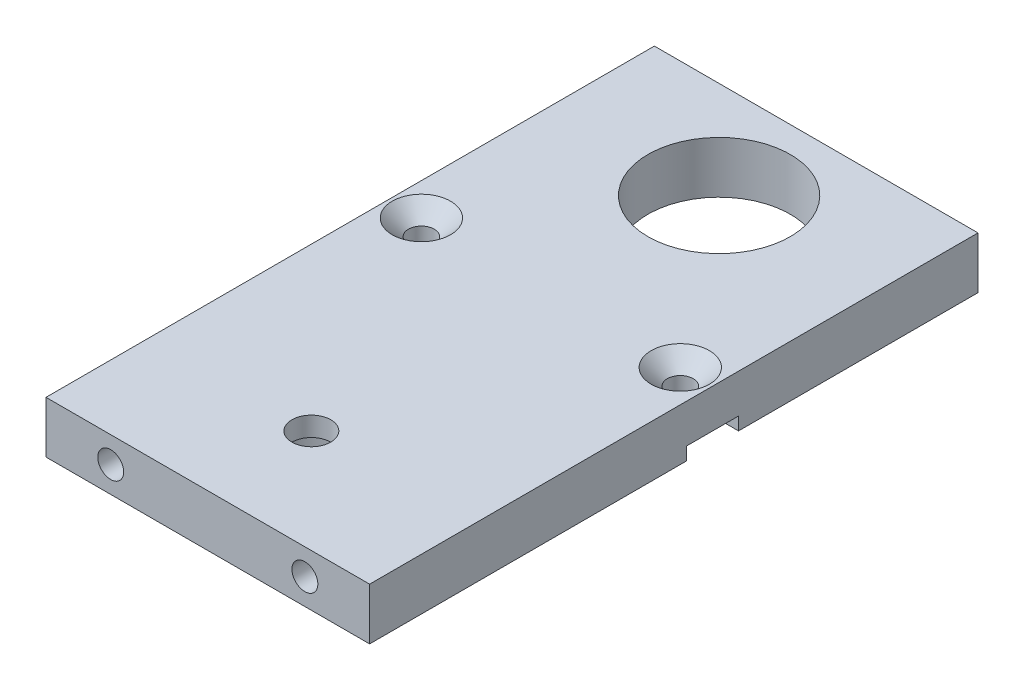
ISO-10303-21;
HEADER;
FILE_DESCRIPTION(('STEP AP214'),'2;1');
FILE_NAME('part.step','',(''),(''),'','','');
FILE_SCHEMA(('AUTOMOTIVE_DESIGN { 1 0 10303 214 1 1 1 1 }'));
ENDSEC;
DATA;
#1=APPLICATION_CONTEXT('core data for automotive mechanical design processes');
#2=APPLICATION_PROTOCOL_DEFINITION('international standard','automotive_design',2000,#1);
#3=PRODUCT_CONTEXT('',#1,'mechanical');
#4=PRODUCT('Part','Part','',(#3));
#5=PRODUCT_RELATED_PRODUCT_CATEGORY('part','',(#4));
#6=PRODUCT_DEFINITION_FORMATION('','',#4);
#7=PRODUCT_DEFINITION_CONTEXT('part definition',#1,'design');
#8=PRODUCT_DEFINITION('design','',#6,#7);
#9=PRODUCT_DEFINITION_SHAPE('','',#8);
#10=(LENGTH_UNIT() NAMED_UNIT(*) SI_UNIT(.MILLI.,.METRE.));
#11=(NAMED_UNIT(*) PLANE_ANGLE_UNIT() SI_UNIT($,.RADIAN.));
#12=(NAMED_UNIT(*) SI_UNIT($,.STERADIAN.) SOLID_ANGLE_UNIT());
#13=UNCERTAINTY_MEASURE_WITH_UNIT(LENGTH_MEASURE(1.E-05),#10,'distance_accuracy_value','');
#14=(GEOMETRIC_REPRESENTATION_CONTEXT(3) GLOBAL_UNCERTAINTY_ASSIGNED_CONTEXT((#13)) GLOBAL_UNIT_ASSIGNED_CONTEXT((#10,
#11,#12)) REPRESENTATION_CONTEXT('',''));
#15=CARTESIAN_POINT('',(0.,0.,0.));
#16=DIRECTION('',(0.,0.,1.));
#17=DIRECTION('',(1.,0.,0.));
#18=AXIS2_PLACEMENT_3D('',#15,#16,#17);
#19=CARTESIAN_POINT('',(0.,0.,0.));
#20=DIRECTION('',(0.,1.,0.));
#21=DIRECTION('',(0.,0.,1.));
#22=AXIS2_PLACEMENT_3D('',#19,#20,#21);
#23=PLANE('',#22);
#24=CARTESIAN_POINT('',(-6.49140893470791,0.,-6.88208118099477));
#25=DIRECTION('',(0.,1.,0.));
#26=DIRECTION('',(0.,0.,1.));
#27=AXIS2_PLACEMENT_3D('',#24,#25,#26);
#28=CIRCLE('',#27,11.);
#29=CARTESIAN_POINT('',(-6.49140893470791,0.,4.11791881900523));
#30=VERTEX_POINT('',#29);
#31=EDGE_CURVE('E163',#30,#30,#28,.T.);
#32=ORIENTED_EDGE('',*,*,#31,.T.);
#33=EDGE_LOOP('',(#32));
#34=FACE_BOUND('',#33,.T.);
#35=DIRECTION('',(0.,0.,-1.));
#36=VECTOR('',#35,1.);
#37=CARTESIAN_POINT('',(18.5085910652921,0.,-21.8820811809948));
#38=LINE('',#37,#36);
#39=CARTESIAN_POINT('',(18.5085910652921,0.,15.1179188190052));
#40=VERTEX_POINT('',#39);
#41=CARTESIAN_POINT('',(18.5085910652921,0.,-21.8820811809948));
#42=VERTEX_POINT('',#41);
#43=EDGE_CURVE('E184',#40,#42,#38,.T.);
#44=ORIENTED_EDGE('',*,*,#43,.F.);
#45=DIRECTION('',(1.,0.,0.));
#46=VECTOR('',#45,1.);
#47=CARTESIAN_POINT('',(18.5085910652921,0.,15.1179188190052));
#48=LINE('',#47,#46);
#49=CARTESIAN_POINT('',(-31.4914089347079,0.,15.1179188190052));
#50=VERTEX_POINT('',#49);
#51=EDGE_CURVE('E125',#50,#40,#48,.T.);
#52=ORIENTED_EDGE('',*,*,#51,.F.);
#53=DIRECTION('',(0.,0.,1.));
#54=VECTOR('',#53,1.);
#55=CARTESIAN_POINT('',(-31.4914089347079,0.,-21.8820811809948));
#56=LINE('',#55,#54);
#57=CARTESIAN_POINT('',(-31.4914089347079,0.,-21.8820811809948));
#58=VERTEX_POINT('',#57);
#59=EDGE_CURVE('E179',#58,#50,#56,.T.);
#60=ORIENTED_EDGE('',*,*,#59,.F.);
#61=DIRECTION('',(-1.,0.,0.));
#62=VECTOR('',#61,1.);
#63=CARTESIAN_POINT('',(-31.4914089347079,0.,-21.8820811809948));
#64=LINE('',#63,#62);
#65=EDGE_CURVE('E80',#42,#58,#64,.T.);
#66=ORIENTED_EDGE('',*,*,#65,.F.);
#67=EDGE_LOOP('',(#44,#52,#60,#66));
#68=FACE_BOUND('',#67,.T.);
#69=ADVANCED_FACE('F34',(#34,#68),#23,.F.);
#70=CARTESIAN_POINT('',(-26.4914089347079,8.,19.1179188190052));
#71=DIRECTION('',(0.,-1.,0.));
#72=DIRECTION('',(0.,0.,-1.));
#73=AXIS2_PLACEMENT_3D('',#70,#71,#72);
#74=CYLINDRICAL_SURFACE('',#73,2.);
#75=CARTESIAN_POINT('',(-26.4914089347079,5.49999999999998,19.1179188190052));
#76=DIRECTION('',(0.,1.,0.));
#77=DIRECTION('',(0.,0.,1.));
#78=AXIS2_PLACEMENT_3D('',#75,#76,#77);
#79=CIRCLE('',#78,2.);
#80=CARTESIAN_POINT('',(-26.4914089347079,5.49999999999998,21.1179188190052));
#81=VERTEX_POINT('',#80);
#82=EDGE_CURVE('E11',#81,#81,#79,.T.);
#83=ORIENTED_EDGE('',*,*,#82,.T.);
#84=EDGE_LOOP('',(#83));
#85=FACE_BOUND('',#84,.T.);
#86=CARTESIAN_POINT('',(-26.4914089347079,2.,19.1179188190052));
#87=DIRECTION('',(0.,-1.,0.));
#88=DIRECTION('',(0.,0.,-1.));
#89=AXIS2_PLACEMENT_3D('',#86,#87,#88);
#90=CIRCLE('',#89,2.);
#91=CARTESIAN_POINT('',(-26.4914089347079,2.,17.1179188190052));
#92=VERTEX_POINT('',#91);
#93=EDGE_CURVE('E138',#92,#92,#90,.T.);
#94=ORIENTED_EDGE('',*,*,#93,.T.);
#95=EDGE_LOOP('',(#94));
#96=FACE_BOUND('',#95,.T.);
#97=ADVANCED_FACE('F215',(#85,#96),#74,.F.);
#98=CARTESIAN_POINT('',(13.5085910652921,8.,19.1179188190052));
#99=DIRECTION('',(0.,-1.,0.));
#100=DIRECTION('',(0.,0.,-1.));
#101=AXIS2_PLACEMENT_3D('',#98,#99,#100);
#102=CYLINDRICAL_SURFACE('',#101,2.);
#103=CARTESIAN_POINT('',(13.5085910652921,5.49999999999998,19.1179188190052));
#104=DIRECTION('',(0.,1.,0.));
#105=DIRECTION('',(0.,0.,1.));
#106=AXIS2_PLACEMENT_3D('',#103,#104,#105);
#107=CIRCLE('',#106,2.);
#108=CARTESIAN_POINT('',(13.5085910652921,5.49999999999998,21.1179188190052));
#109=VERTEX_POINT('',#108);
#110=EDGE_CURVE('E194',#109,#109,#107,.T.);
#111=ORIENTED_EDGE('',*,*,#110,.T.);
#112=EDGE_LOOP('',(#111));
#113=FACE_BOUND('',#112,.T.);
#114=CARTESIAN_POINT('',(13.5085910652921,2.,19.1179188190052));
#115=DIRECTION('',(0.,-1.,0.));
#116=DIRECTION('',(0.,0.,-1.));
#117=AXIS2_PLACEMENT_3D('',#114,#115,#116);
#118=CIRCLE('',#117,2.);
#119=CARTESIAN_POINT('',(13.5085910652921,2.,17.1179188190052));
#120=VERTEX_POINT('',#119);
#121=EDGE_CURVE('E38',#120,#120,#118,.T.);
#122=ORIENTED_EDGE('',*,*,#121,.T.);
#123=EDGE_LOOP('',(#122));
#124=FACE_BOUND('',#123,.T.);
#125=ADVANCED_FACE('F212',(#113,#124),#102,.F.);
#126=CARTESIAN_POINT('',(0.,8.,0.));
#127=DIRECTION('',(0.,1.,0.));
#128=DIRECTION('',(0.,0.,1.));
#129=AXIS2_PLACEMENT_3D('',#126,#127,#128);
#130=PLANE('',#129);
#131=CARTESIAN_POINT('',(-6.49140893470789,8.,56.1179188190052));
#132=DIRECTION('',(0.,-1.,0.));
#133=DIRECTION('',(0.,0.,-1.));
#134=AXIS2_PLACEMENT_3D('',#131,#132,#133);
#135=CIRCLE('',#134,3.);
#136=CARTESIAN_POINT('',(-6.49140893470789,8.,53.1179188190052));
#137=VERTEX_POINT('',#136);
#138=EDGE_CURVE('E142',#137,#137,#135,.T.);
#139=ORIENTED_EDGE('',*,*,#138,.T.);
#140=EDGE_LOOP('',(#139));
#141=FACE_BOUND('',#140,.T.);
#142=CARTESIAN_POINT('',(13.5085910652921,8.,19.1179188190052));
#143=DIRECTION('',(0.,1.,0.));
#144=DIRECTION('',(0.,0.,1.));
#145=AXIS2_PLACEMENT_3D('',#142,#143,#144);
#146=CIRCLE('',#145,4.50000000000004);
#147=CARTESIAN_POINT('',(13.5085910652921,8.,23.6179188190053));
#148=VERTEX_POINT('',#147);
#149=EDGE_CURVE('E43',#148,#148,#146,.F.);
#150=ORIENTED_EDGE('',*,*,#149,.T.);
#151=EDGE_LOOP('',(#150));
#152=FACE_BOUND('',#151,.T.);
#153=CARTESIAN_POINT('',(-26.4914089347079,8.,19.1179188190052));
#154=DIRECTION('',(0.,1.,0.));
#155=DIRECTION('',(0.,0.,1.));
#156=AXIS2_PLACEMENT_3D('',#153,#154,#155);
#157=CIRCLE('',#156,4.50000000000004);
#158=CARTESIAN_POINT('',(-26.4914089347079,8.,23.6179188190053));
#159=VERTEX_POINT('',#158);
#160=EDGE_CURVE('E197',#159,#159,#157,.F.);
#161=ORIENTED_EDGE('',*,*,#160,.T.);
#162=EDGE_LOOP('',(#161));
#163=FACE_BOUND('',#162,.T.);
#164=DIRECTION('',(0.,0.,1.));
#165=VECTOR('',#164,1.);
#166=CARTESIAN_POINT('',(-31.4914089347079,8.,-21.8820811809948));
#167=LINE('',#166,#165);
#168=CARTESIAN_POINT('',(-31.4914089347079,8.,-21.8820811809948));
#169=VERTEX_POINT('',#168);
#170=CARTESIAN_POINT('',(-31.4914089347079,8.,72.1179188190052));
#171=VERTEX_POINT('',#170);
#172=EDGE_CURVE('E172',#169,#171,#167,.T.);
#173=ORIENTED_EDGE('',*,*,#172,.T.);
#174=DIRECTION('',(1.,0.,0.));
#175=VECTOR('',#174,1.);
#176=CARTESIAN_POINT('',(-31.4914089347079,8.,72.1179188190052));
#177=LINE('',#176,#175);
#178=CARTESIAN_POINT('',(18.5085910652921,8.,72.1179188190052));
#179=VERTEX_POINT('',#178);
#180=EDGE_CURVE('E88',#171,#179,#177,.T.);
#181=ORIENTED_EDGE('',*,*,#180,.T.);
#182=DIRECTION('',(0.,0.,-1.));
#183=VECTOR('',#182,1.);
#184=CARTESIAN_POINT('',(18.5085910652921,8.,-21.8820811809948));
#185=LINE('',#184,#183);
#186=CARTESIAN_POINT('',(18.5085910652921,8.,-21.8820811809948));
#187=VERTEX_POINT('',#186);
#188=EDGE_CURVE('E175',#179,#187,#185,.T.);
#189=ORIENTED_EDGE('',*,*,#188,.T.);
#190=DIRECTION('',(-1.,0.,0.));
#191=VECTOR('',#190,1.);
#192=CARTESIAN_POINT('',(-31.4914089347079,8.,-21.8820811809948));
#193=LINE('',#192,#191);
#194=EDGE_CURVE('E59',#187,#169,#193,.T.);
#195=ORIENTED_EDGE('',*,*,#194,.T.);
#196=EDGE_LOOP('',(#173,#181,#189,#195));
#197=FACE_BOUND('',#196,.T.);
#198=CARTESIAN_POINT('',(-6.49140893470791,8.,-6.88208118099477));
#199=DIRECTION('',(0.,1.,0.));
#200=DIRECTION('',(0.,0.,1.));
#201=AXIS2_PLACEMENT_3D('',#198,#199,#200);
#202=CIRCLE('',#201,11.);
#203=CARTESIAN_POINT('',(-6.49140893470791,8.,4.11791881900523));
#204=VERTEX_POINT('',#203);
#205=EDGE_CURVE('E166',#204,#204,#202,.T.);
#206=ORIENTED_EDGE('',*,*,#205,.F.);
#207=EDGE_LOOP('',(#206));
#208=FACE_BOUND('',#207,.T.);
#209=ADVANCED_FACE('F203',(#141,#152,#163,#197,#208),#130,.T.);
#210=CARTESIAN_POINT('',(-6.49140893470789,0.,56.1179188190052));
#211=DIRECTION('',(0.,-1.,0.));
#212=DIRECTION('',(0.,0.,-1.));
#213=AXIS2_PLACEMENT_3D('',#210,#211,#212);
#214=CIRCLE('',#213,8.);
#215=CARTESIAN_POINT('',(-6.49140893470789,0.,48.1179188190052));
#216=VERTEX_POINT('',#215);
#217=EDGE_CURVE('E145',#216,#216,#214,.T.);
#218=ORIENTED_EDGE('',*,*,#217,.F.);
#219=EDGE_LOOP('',(#218));
#220=FACE_BOUND('',#219,.T.);
#221=CARTESIAN_POINT('',(-31.4914089347079,0.,23.1179188190052));
#222=VERTEX_POINT('',#221);
#223=CARTESIAN_POINT('',(-31.4914089347079,0.,72.1179188190052));
#224=VERTEX_POINT('',#223);
#225=EDGE_CURVE('E169',#222,#224,#56,.T.);
#226=ORIENTED_EDGE('',*,*,#225,.F.);
#227=DIRECTION('',(-1.,0.,0.));
#228=VECTOR('',#227,1.);
#229=CARTESIAN_POINT('',(18.5085910652921,0.,23.1179188190052));
#230=LINE('',#229,#228);
#231=CARTESIAN_POINT('',(18.5085910652921,0.,23.1179188190052));
#232=VERTEX_POINT('',#231);
#233=EDGE_CURVE('E225',#232,#222,#230,.T.);
#234=ORIENTED_EDGE('',*,*,#233,.F.);
#235=CARTESIAN_POINT('',(18.5085910652921,0.,72.1179188190052));
#236=VERTEX_POINT('',#235);
#237=EDGE_CURVE('E131',#236,#232,#38,.T.);
#238=ORIENTED_EDGE('',*,*,#237,.F.);
#239=DIRECTION('',(1.,0.,0.));
#240=VECTOR('',#239,1.);
#241=CARTESIAN_POINT('',(-31.4914089347079,0.,72.1179188190052));
#242=LINE('',#241,#240);
#243=EDGE_CURVE('E182',#224,#236,#242,.T.);
#244=ORIENTED_EDGE('',*,*,#243,.F.);
#245=EDGE_LOOP('',(#226,#234,#238,#244));
#246=FACE_BOUND('',#245,.T.);
#247=ADVANCED_FACE('F245',(#220,#246),#23,.F.);
#248=CARTESIAN_POINT('',(-31.4914089347079,8.,-21.8820811809948));
#249=DIRECTION('',(1.,0.,0.));
#250=DIRECTION('',(0.,0.,-1.));
#251=AXIS2_PLACEMENT_3D('',#248,#249,#250);
#252=PLANE('',#251);
#253=ORIENTED_EDGE('',*,*,#59,.T.);
#254=DIRECTION('',(0.,-1.,0.));
#255=VECTOR('',#254,1.);
#256=CARTESIAN_POINT('',(-31.4914089347079,2.,15.1179188190052));
#257=LINE('',#256,#255);
#258=CARTESIAN_POINT('',(-31.4914089347079,2.,15.1179188190052));
#259=VERTEX_POINT('',#258);
#260=EDGE_CURVE('E133',#259,#50,#257,.T.);
#261=ORIENTED_EDGE('',*,*,#260,.F.);
#262=DIRECTION('',(0.,0.,-1.));
#263=VECTOR('',#262,1.);
#264=CARTESIAN_POINT('',(-31.4914089347079,2.,15.1179188190052));
#265=LINE('',#264,#263);
#266=CARTESIAN_POINT('',(-31.4914089347079,2.,23.1179188190052));
#267=VERTEX_POINT('',#266);
#268=EDGE_CURVE('E118',#267,#259,#265,.T.);
#269=ORIENTED_EDGE('',*,*,#268,.F.);
#270=DIRECTION('',(0.,-1.,0.));
#271=VECTOR('',#270,1.);
#272=CARTESIAN_POINT('',(-31.4914089347079,2.,23.1179188190052));
#273=LINE('',#272,#271);
#274=EDGE_CURVE('E116',#267,#222,#273,.T.);
#275=ORIENTED_EDGE('',*,*,#274,.T.);
#276=ORIENTED_EDGE('',*,*,#225,.T.);
#277=DIRECTION('',(0.,-1.,0.));
#278=VECTOR('',#277,1.);
#279=CARTESIAN_POINT('',(-31.4914089347079,8.,72.1179188190052));
#280=LINE('',#279,#278);
#281=EDGE_CURVE('E192',#171,#224,#280,.T.);
#282=ORIENTED_EDGE('',*,*,#281,.F.);
#283=ORIENTED_EDGE('',*,*,#172,.F.);
#284=DIRECTION('',(0.,-1.,0.));
#285=VECTOR('',#284,1.);
#286=CARTESIAN_POINT('',(-31.4914089347079,8.,-21.8820811809948));
#287=LINE('',#286,#285);
#288=EDGE_CURVE('E178',#169,#58,#287,.T.);
#289=ORIENTED_EDGE('',*,*,#288,.T.);
#290=EDGE_LOOP('',(#253,#261,#269,#275,#276,#282,#283,#289));
#291=FACE_BOUND('',#290,.T.);
#292=ADVANCED_FACE('F232',(#291),#252,.F.);
#293=CARTESIAN_POINT('',(-31.4914089347079,8.,72.1179188190052));
#294=DIRECTION('',(0.,0.,-1.));
#295=DIRECTION('',(-1.,0.,0.));
#296=AXIS2_PLACEMENT_3D('',#293,#294,#295);
#297=PLANE('',#296);
#298=CARTESIAN_POINT('',(8.50859106529211,4.,72.1179188190052));
#299=DIRECTION('',(0.,0.,1.));
#300=DIRECTION('',(1.,0.,0.));
#301=AXIS2_PLACEMENT_3D('',#298,#299,#300);
#302=CIRCLE('',#301,2.);
#303=CARTESIAN_POINT('',(10.5085910652921,4.,72.1179188190052));
#304=VERTEX_POINT('',#303);
#305=EDGE_CURVE('E151',#304,#304,#302,.T.);
#306=ORIENTED_EDGE('',*,*,#305,.F.);
#307=EDGE_LOOP('',(#306));
#308=FACE_BOUND('',#307,.T.);
#309=CARTESIAN_POINT('',(-21.4914089347079,4.,72.1179188190052));
#310=DIRECTION('',(0.,0.,1.));
#311=DIRECTION('',(1.,0.,0.));
#312=AXIS2_PLACEMENT_3D('',#309,#310,#311);
#313=CIRCLE('',#312,2.00000000000001);
#314=CARTESIAN_POINT('',(-19.4914089347079,4.,72.1179188190052));
#315=VERTEX_POINT('',#314);
#316=EDGE_CURVE('E157',#315,#315,#313,.T.);
#317=ORIENTED_EDGE('',*,*,#316,.F.);
#318=EDGE_LOOP('',(#317));
#319=FACE_BOUND('',#318,.T.);
#320=ORIENTED_EDGE('',*,*,#243,.T.);
#321=DIRECTION('',(0.,-1.,0.));
#322=VECTOR('',#321,1.);
#323=CARTESIAN_POINT('',(18.5085910652921,8.,72.1179188190052));
#324=LINE('',#323,#322);
#325=EDGE_CURVE('E190',#179,#236,#324,.T.);
#326=ORIENTED_EDGE('',*,*,#325,.F.);
#327=ORIENTED_EDGE('',*,*,#180,.F.);
#328=ORIENTED_EDGE('',*,*,#281,.T.);
#329=EDGE_LOOP('',(#320,#326,#327,#328));
#330=FACE_BOUND('',#329,.T.);
#331=ADVANCED_FACE('F241',(#308,#319,#330),#297,.F.);
#332=CARTESIAN_POINT('',(18.5085910652921,8.,-21.8820811809948));
#333=DIRECTION('',(-1.,0.,0.));
#334=DIRECTION('',(0.,0.,1.));
#335=AXIS2_PLACEMENT_3D('',#332,#333,#334);
#336=PLANE('',#335);
#337=DIRECTION('',(0.,0.,1.));
#338=VECTOR('',#337,1.);
#339=CARTESIAN_POINT('',(18.5085910652921,2.,15.1179188190052));
#340=LINE('',#339,#338);
#341=CARTESIAN_POINT('',(18.5085910652921,2.,15.1179188190052));
#342=VERTEX_POINT('',#341);
#343=CARTESIAN_POINT('',(18.5085910652921,2.,23.1179188190052));
#344=VERTEX_POINT('',#343);
#345=EDGE_CURVE('E119',#342,#344,#340,.T.);
#346=ORIENTED_EDGE('',*,*,#345,.F.);
#347=DIRECTION('',(0.,-1.,0.));
#348=VECTOR('',#347,1.);
#349=CARTESIAN_POINT('',(18.5085910652921,2.,15.1179188190052));
#350=LINE('',#349,#348);
#351=EDGE_CURVE('E220',#342,#40,#350,.T.);
#352=ORIENTED_EDGE('',*,*,#351,.T.);
#353=ORIENTED_EDGE('',*,*,#43,.T.);
#354=DIRECTION('',(0.,-1.,0.));
#355=VECTOR('',#354,1.);
#356=CARTESIAN_POINT('',(18.5085910652921,8.,-21.8820811809948));
#357=LINE('',#356,#355);
#358=EDGE_CURVE('E188',#187,#42,#357,.T.);
#359=ORIENTED_EDGE('',*,*,#358,.F.);
#360=ORIENTED_EDGE('',*,*,#188,.F.);
#361=ORIENTED_EDGE('',*,*,#325,.T.);
#362=ORIENTED_EDGE('',*,*,#237,.T.);
#363=DIRECTION('',(0.,-1.,0.));
#364=VECTOR('',#363,1.);
#365=CARTESIAN_POINT('',(18.5085910652921,2.,23.1179188190052));
#366=LINE('',#365,#364);
#367=EDGE_CURVE('E113',#344,#232,#366,.T.);
#368=ORIENTED_EDGE('',*,*,#367,.F.);
#369=EDGE_LOOP('',(#346,#352,#353,#359,#360,#361,#362,#368));
#370=FACE_BOUND('',#369,.T.);
#371=ADVANCED_FACE('F128',(#370),#336,.F.);
#372=CARTESIAN_POINT('',(-31.4914089347079,8.,-21.8820811809948));
#373=DIRECTION('',(0.,0.,1.));
#374=DIRECTION('',(1.,0.,0.));
#375=AXIS2_PLACEMENT_3D('',#372,#373,#374);
#376=PLANE('',#375);
#377=ORIENTED_EDGE('',*,*,#65,.T.);
#378=ORIENTED_EDGE('',*,*,#288,.F.);
#379=ORIENTED_EDGE('',*,*,#194,.F.);
#380=ORIENTED_EDGE('',*,*,#358,.T.);
#381=EDGE_LOOP('',(#377,#378,#379,#380));
#382=FACE_BOUND('',#381,.T.);
#383=ADVANCED_FACE('F238',(#382),#376,.F.);
#384=CARTESIAN_POINT('',(-6.49140893470791,8.,-6.88208118099477));
#385=DIRECTION('',(0.,-1.,0.));
#386=DIRECTION('',(0.,0.,-1.));
#387=AXIS2_PLACEMENT_3D('',#384,#385,#386);
#388=CYLINDRICAL_SURFACE('',#387,11.);
#389=ORIENTED_EDGE('',*,*,#205,.T.);
#390=EDGE_LOOP('',(#389));
#391=FACE_BOUND('',#390,.T.);
#392=ORIENTED_EDGE('',*,*,#31,.F.);
#393=EDGE_LOOP('',(#392));
#394=FACE_BOUND('',#393,.T.);
#395=ADVANCED_FACE('F209',(#391,#394),#388,.F.);
#396=CARTESIAN_POINT('',(13.5085910652921,5.49999999999998,19.1179188190052));
#397=DIRECTION('',(0.,1.,0.));
#398=DIRECTION('',(0.,0.,1.));
#399=AXIS2_PLACEMENT_3D('',#396,#397,#398);
#400=CONICAL_SURFACE('',#399,2.,0.78539816339745);
#401=ORIENTED_EDGE('',*,*,#149,.F.);
#402=EDGE_LOOP('',(#401));
#403=FACE_BOUND('',#402,.T.);
#404=ORIENTED_EDGE('',*,*,#110,.F.);
#405=EDGE_LOOP('',(#404));
#406=FACE_BOUND('',#405,.T.);
#407=ADVANCED_FACE('F206',(#403,#406),#400,.F.);
#408=CARTESIAN_POINT('',(-26.4914089347079,5.49999999999998,19.1179188190052));
#409=DIRECTION('',(0.,1.,0.));
#410=DIRECTION('',(0.,0.,1.));
#411=AXIS2_PLACEMENT_3D('',#408,#409,#410);
#412=CONICAL_SURFACE('',#411,2.,0.78539816339745);
#413=ORIENTED_EDGE('',*,*,#160,.F.);
#414=EDGE_LOOP('',(#413));
#415=FACE_BOUND('',#414,.T.);
#416=ORIENTED_EDGE('',*,*,#82,.F.);
#417=EDGE_LOOP('',(#416));
#418=FACE_BOUND('',#417,.T.);
#419=ADVANCED_FACE('F36',(#415,#418),#412,.F.);
#420=CARTESIAN_POINT('',(-21.4914089347079,4.,62.1179188190052));
#421=DIRECTION('',(0.,0.,1.));
#422=DIRECTION('',(1.,0.,0.));
#423=AXIS2_PLACEMENT_3D('',#420,#421,#422);
#424=CYLINDRICAL_SURFACE('',#423,2.00000000000001);
#425=CARTESIAN_POINT('',(-21.4914089347079,4.,62.1179188190052));
#426=DIRECTION('',(0.,0.,1.));
#427=DIRECTION('',(1.,0.,0.));
#428=AXIS2_PLACEMENT_3D('',#425,#426,#427);
#429=CIRCLE('',#428,2.00000000000001);
#430=CARTESIAN_POINT('',(-19.4914089347079,4.,62.1179188190052));
#431=VERTEX_POINT('',#430);
#432=EDGE_CURVE('E160',#431,#431,#429,.T.);
#433=ORIENTED_EDGE('',*,*,#432,.F.);
#434=EDGE_LOOP('',(#433));
#435=FACE_BOUND('',#434,.T.);
#436=ORIENTED_EDGE('',*,*,#316,.T.);
#437=EDGE_LOOP('',(#436));
#438=FACE_BOUND('',#437,.T.);
#439=ADVANCED_FACE('F274',(#435,#438),#424,.F.);
#440=CARTESIAN_POINT('',(-21.4914089347079,4.,62.1179188190052));
#441=DIRECTION('',(0.,0.,1.));
#442=DIRECTION('',(1.,0.,0.));
#443=AXIS2_PLACEMENT_3D('',#440,#441,#442);
#444=PLANE('',#443);
#445=ORIENTED_EDGE('',*,*,#432,.T.);
#446=EDGE_LOOP('',(#445));
#447=FACE_BOUND('',#446,.T.);
#448=ADVANCED_FACE('F277',(#447),#444,.T.);
#449=CARTESIAN_POINT('',(8.50859106529211,4.,62.1179188190052));
#450=DIRECTION('',(0.,0.,1.));
#451=DIRECTION('',(1.,0.,0.));
#452=AXIS2_PLACEMENT_3D('',#449,#450,#451);
#453=CYLINDRICAL_SURFACE('',#452,2.);
#454=CARTESIAN_POINT('',(8.50859106529211,4.,62.1179188190052));
#455=DIRECTION('',(0.,0.,1.));
#456=DIRECTION('',(1.,0.,0.));
#457=AXIS2_PLACEMENT_3D('',#454,#455,#456);
#458=CIRCLE('',#457,2.);
#459=CARTESIAN_POINT('',(10.5085910652921,4.,62.1179188190052));
#460=VERTEX_POINT('',#459);
#461=EDGE_CURVE('E154',#460,#460,#458,.T.);
#462=ORIENTED_EDGE('',*,*,#461,.F.);
#463=EDGE_LOOP('',(#462));
#464=FACE_BOUND('',#463,.T.);
#465=ORIENTED_EDGE('',*,*,#305,.T.);
#466=EDGE_LOOP('',(#465));
#467=FACE_BOUND('',#466,.T.);
#468=ADVANCED_FACE('F281',(#464,#467),#453,.F.);
#469=CARTESIAN_POINT('',(8.50859106529211,4.,62.1179188190052));
#470=DIRECTION('',(0.,0.,1.));
#471=DIRECTION('',(1.,0.,0.));
#472=AXIS2_PLACEMENT_3D('',#469,#470,#471);
#473=PLANE('',#472);
#474=ORIENTED_EDGE('',*,*,#461,.T.);
#475=EDGE_LOOP('',(#474));
#476=FACE_BOUND('',#475,.T.);
#477=ADVANCED_FACE('F285',(#476),#473,.T.);
#478=CARTESIAN_POINT('',(-6.49140893470789,5.,56.1179188190052));
#479=DIRECTION('',(0.,-1.,0.));
#480=DIRECTION('',(0.,0.,-1.));
#481=AXIS2_PLACEMENT_3D('',#478,#479,#480);
#482=CYLINDRICAL_SURFACE('',#481,8.);
#483=CARTESIAN_POINT('',(-6.49140893470789,5.,56.1179188190052));
#484=DIRECTION('',(0.,-1.,0.));
#485=DIRECTION('',(0.,0.,-1.));
#486=AXIS2_PLACEMENT_3D('',#483,#484,#485);
#487=CIRCLE('',#486,8.);
#488=CARTESIAN_POINT('',(-6.49140893470789,5.,48.1179188190052));
#489=VERTEX_POINT('',#488);
#490=EDGE_CURVE('E148',#489,#489,#487,.T.);
#491=ORIENTED_EDGE('',*,*,#490,.F.);
#492=EDGE_LOOP('',(#491));
#493=FACE_BOUND('',#492,.T.);
#494=ORIENTED_EDGE('',*,*,#217,.T.);
#495=EDGE_LOOP('',(#494));
#496=FACE_BOUND('',#495,.T.);
#497=ADVANCED_FACE('F289',(#493,#496),#482,.F.);
#498=CARTESIAN_POINT('',(-6.49140893470789,5.,56.1179188190052));
#499=DIRECTION('',(0.,-1.,0.));
#500=DIRECTION('',(0.,0.,-1.));
#501=AXIS2_PLACEMENT_3D('',#498,#499,#500);
#502=PLANE('',#501);
#503=CARTESIAN_POINT('',(-6.49140893470789,5.,56.1179188190052));
#504=DIRECTION('',(0.,-1.,0.));
#505=DIRECTION('',(0.,0.,-1.));
#506=AXIS2_PLACEMENT_3D('',#503,#504,#505);
#507=CIRCLE('',#506,3.);
#508=CARTESIAN_POINT('',(-6.49140893470789,5.,53.1179188190052));
#509=VERTEX_POINT('',#508);
#510=EDGE_CURVE('E141',#509,#509,#507,.T.);
#511=ORIENTED_EDGE('',*,*,#510,.F.);
#512=EDGE_LOOP('',(#511));
#513=FACE_BOUND('',#512,.T.);
#514=ORIENTED_EDGE('',*,*,#490,.T.);
#515=EDGE_LOOP('',(#514));
#516=FACE_BOUND('',#515,.T.);
#517=ADVANCED_FACE('F293',(#513,#516),#502,.T.);
#518=CARTESIAN_POINT('',(-6.49140893470789,8.,56.1179188190052));
#519=DIRECTION('',(0.,-1.,0.));
#520=DIRECTION('',(0.,0.,-1.));
#521=AXIS2_PLACEMENT_3D('',#518,#519,#520);
#522=CYLINDRICAL_SURFACE('',#521,3.);
#523=ORIENTED_EDGE('',*,*,#138,.F.);
#524=EDGE_LOOP('',(#523));
#525=FACE_BOUND('',#524,.T.);
#526=ORIENTED_EDGE('',*,*,#510,.T.);
#527=EDGE_LOOP('',(#526));
#528=FACE_BOUND('',#527,.T.);
#529=ADVANCED_FACE('F297',(#525,#528),#522,.F.);
#530=CARTESIAN_POINT('',(18.5085910652921,2.,15.1179188190052));
#531=DIRECTION('',(0.,0.,-1.));
#532=DIRECTION('',(-1.,0.,0.));
#533=AXIS2_PLACEMENT_3D('',#530,#531,#532);
#534=PLANE('',#533);
#535=ORIENTED_EDGE('',*,*,#51,.T.);
#536=ORIENTED_EDGE('',*,*,#351,.F.);
#537=DIRECTION('',(1.,0.,0.));
#538=VECTOR('',#537,1.);
#539=CARTESIAN_POINT('',(18.5085910652921,2.,15.1179188190052));
#540=LINE('',#539,#538);
#541=EDGE_CURVE('E50',#259,#342,#540,.T.);
#542=ORIENTED_EDGE('',*,*,#541,.F.);
#543=ORIENTED_EDGE('',*,*,#260,.T.);
#544=EDGE_LOOP('',(#535,#536,#542,#543));
#545=FACE_BOUND('',#544,.T.);
#546=ADVANCED_FACE('F230',(#545),#534,.F.);
#547=CARTESIAN_POINT('',(18.5085910652921,2.,23.1179188190052));
#548=DIRECTION('',(0.,0.,1.));
#549=DIRECTION('',(1.,0.,0.));
#550=AXIS2_PLACEMENT_3D('',#547,#548,#549);
#551=PLANE('',#550);
#552=ORIENTED_EDGE('',*,*,#233,.T.);
#553=ORIENTED_EDGE('',*,*,#274,.F.);
#554=DIRECTION('',(-1.,0.,0.));
#555=VECTOR('',#554,1.);
#556=CARTESIAN_POINT('',(18.5085910652921,2.,23.1179188190052));
#557=LINE('',#556,#555);
#558=EDGE_CURVE('E110',#344,#267,#557,.T.);
#559=ORIENTED_EDGE('',*,*,#558,.F.);
#560=ORIENTED_EDGE('',*,*,#367,.T.);
#561=EDGE_LOOP('',(#552,#553,#559,#560));
#562=FACE_BOUND('',#561,.T.);
#563=ADVANCED_FACE('F111',(#562),#551,.F.);
#564=CARTESIAN_POINT('',(0.,2.,0.));
#565=DIRECTION('',(0.,-1.,0.));
#566=DIRECTION('',(0.,0.,-1.));
#567=AXIS2_PLACEMENT_3D('',#564,#565,#566);
#568=PLANE('',#567);
#569=ORIENTED_EDGE('',*,*,#93,.F.);
#570=EDGE_LOOP('',(#569));
#571=FACE_BOUND('',#570,.T.);
#572=ORIENTED_EDGE('',*,*,#121,.F.);
#573=EDGE_LOOP('',(#572));
#574=FACE_BOUND('',#573,.T.);
#575=ORIENTED_EDGE('',*,*,#345,.T.);
#576=ORIENTED_EDGE('',*,*,#558,.T.);
#577=ORIENTED_EDGE('',*,*,#268,.T.);
#578=ORIENTED_EDGE('',*,*,#541,.T.);
#579=EDGE_LOOP('',(#575,#576,#577,#578));
#580=FACE_BOUND('',#579,.T.);
#581=ADVANCED_FACE('F122',(#571,#574,#580),#568,.T.);
#582=CLOSED_SHELL('',(#69,#97,#125,#209,#247,#292,#331,#371,#383,#395,#407,#419,#439,#448,#468,
#477,#497,#517,#529,#546,#563,#581));
#583=MANIFOLD_SOLID_BREP('B2',#582);
#584=ADVANCED_BREP_SHAPE_REPRESENTATION('',(#18,#583),#14);
#585=SHAPE_DEFINITION_REPRESENTATION(#9,#584);
ENDSEC;
END-ISO-10303-21;
